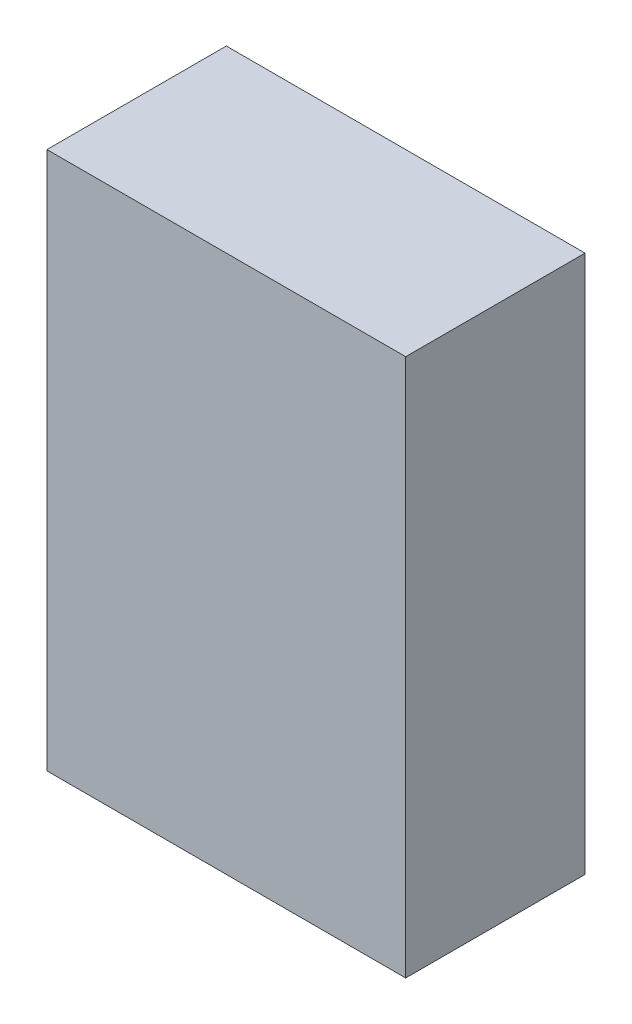
ISO-10303-21;
HEADER;
FILE_DESCRIPTION(('STEP AP214'),'2;1');
FILE_NAME('part.step','',(''),(''),'','','');
FILE_SCHEMA(('AUTOMOTIVE_DESIGN { 1 0 10303 214 1 1 1 1 }'));
ENDSEC;
DATA;
#1=APPLICATION_CONTEXT('core data for automotive mechanical design processes');
#2=APPLICATION_PROTOCOL_DEFINITION('international standard','automotive_design',2000,#1);
#3=PRODUCT_CONTEXT('',#1,'mechanical');
#4=PRODUCT('Part','Part','',(#3));
#5=PRODUCT_RELATED_PRODUCT_CATEGORY('part','',(#4));
#6=PRODUCT_DEFINITION_FORMATION('','',#4);
#7=PRODUCT_DEFINITION_CONTEXT('part definition',#1,'design');
#8=PRODUCT_DEFINITION('design','',#6,#7);
#9=PRODUCT_DEFINITION_SHAPE('','',#8);
#10=(LENGTH_UNIT() NAMED_UNIT(*) SI_UNIT(.MILLI.,.METRE.));
#11=(NAMED_UNIT(*) PLANE_ANGLE_UNIT() SI_UNIT($,.RADIAN.));
#12=(NAMED_UNIT(*) SI_UNIT($,.STERADIAN.) SOLID_ANGLE_UNIT());
#13=UNCERTAINTY_MEASURE_WITH_UNIT(LENGTH_MEASURE(1.E-05),#10,'distance_accuracy_value','');
#14=(GEOMETRIC_REPRESENTATION_CONTEXT(3) GLOBAL_UNCERTAINTY_ASSIGNED_CONTEXT((#13)) GLOBAL_UNIT_ASSIGNED_CONTEXT((#10,
#11,#12)) REPRESENTATION_CONTEXT('',''));
#15=CARTESIAN_POINT('',(0.,0.,0.));
#16=DIRECTION('',(0.,0.,1.));
#17=DIRECTION('',(1.,0.,0.));
#18=AXIS2_PLACEMENT_3D('',#15,#16,#17);
#19=CARTESIAN_POINT('',(-1.38414634146342,28.5243902439024,10.));
#20=DIRECTION('',(1.,0.,0.));
#21=DIRECTION('',(0.,1.,0.));
#22=AXIS2_PLACEMENT_3D('',#19,#20,#21);
#23=PLANE('',#22);
#24=DIRECTION('',(0.,-1.,0.));
#25=VECTOR('',#24,1.);
#26=CARTESIAN_POINT('',(-1.38414634146342,28.5243902439024,0.));
#27=LINE('',#26,#25);
#28=CARTESIAN_POINT('',(-1.38414634146342,28.5243902439024,0.));
#29=VERTEX_POINT('',#28);
#30=CARTESIAN_POINT('',(-1.38414634146341,-1.47560975609756,0.));
#31=VERTEX_POINT('',#30);
#32=EDGE_CURVE('E95',#29,#31,#27,.T.);
#33=ORIENTED_EDGE('',*,*,#32,.T.);
#34=DIRECTION('',(0.,0.,-1.));
#35=VECTOR('',#34,1.);
#36=CARTESIAN_POINT('',(-1.38414634146341,-1.47560975609756,10.));
#37=LINE('',#36,#35);
#38=CARTESIAN_POINT('',(-1.38414634146341,-1.47560975609756,10.));
#39=VERTEX_POINT('',#38);
#40=EDGE_CURVE('E11',#39,#31,#37,.T.);
#41=ORIENTED_EDGE('',*,*,#40,.F.);
#42=DIRECTION('',(0.,-1.,0.));
#43=VECTOR('',#42,1.);
#44=CARTESIAN_POINT('',(-1.38414634146342,28.5243902439024,10.));
#45=LINE('',#44,#43);
#46=CARTESIAN_POINT('',(-1.38414634146342,28.5243902439024,10.));
#47=VERTEX_POINT('',#46);
#48=EDGE_CURVE('E83',#47,#39,#45,.T.);
#49=ORIENTED_EDGE('',*,*,#48,.F.);
#50=DIRECTION('',(0.,0.,-1.));
#51=VECTOR('',#50,1.);
#52=CARTESIAN_POINT('',(-1.38414634146342,28.5243902439024,10.));
#53=LINE('',#52,#51);
#54=EDGE_CURVE('E91',#47,#29,#53,.T.);
#55=ORIENTED_EDGE('',*,*,#54,.T.);
#56=EDGE_LOOP('',(#33,#41,#49,#55));
#57=FACE_BOUND('',#56,.T.);
#58=ADVANCED_FACE('F32',(#57),#23,.F.);
#59=CARTESIAN_POINT('',(-1.38414634146341,-1.47560975609756,10.));
#60=DIRECTION('',(0.,1.,0.));
#61=DIRECTION('',(0.,0.,1.));
#62=AXIS2_PLACEMENT_3D('',#59,#60,#61);
#63=PLANE('',#62);
#64=DIRECTION('',(1.,0.,0.));
#65=VECTOR('',#64,1.);
#66=CARTESIAN_POINT('',(-1.38414634146341,-1.47560975609756,0.));
#67=LINE('',#66,#65);
#68=CARTESIAN_POINT('',(18.6158536585366,-1.47560975609756,0.));
#69=VERTEX_POINT('',#68);
#70=EDGE_CURVE('E87',#31,#69,#67,.T.);
#71=ORIENTED_EDGE('',*,*,#70,.T.);
#72=DIRECTION('',(0.,0.,-1.));
#73=VECTOR('',#72,1.);
#74=CARTESIAN_POINT('',(18.6158536585366,-1.47560975609756,10.));
#75=LINE('',#74,#73);
#76=CARTESIAN_POINT('',(18.6158536585366,-1.47560975609756,10.));
#77=VERTEX_POINT('',#76);
#78=EDGE_CURVE('E40',#77,#69,#75,.T.);
#79=ORIENTED_EDGE('',*,*,#78,.F.);
#80=DIRECTION('',(1.,0.,0.));
#81=VECTOR('',#80,1.);
#82=CARTESIAN_POINT('',(-1.38414634146341,-1.47560975609756,10.));
#83=LINE('',#82,#81);
#84=EDGE_CURVE('E78',#39,#77,#83,.T.);
#85=ORIENTED_EDGE('',*,*,#84,.F.);
#86=ORIENTED_EDGE('',*,*,#40,.T.);
#87=EDGE_LOOP('',(#71,#79,#85,#86));
#88=FACE_BOUND('',#87,.T.);
#89=ADVANCED_FACE('F86',(#88),#63,.F.);
#90=CARTESIAN_POINT('',(18.6158536585366,28.5243902439024,10.));
#91=DIRECTION('',(-1.,0.,0.));
#92=DIRECTION('',(0.,0.,1.));
#93=AXIS2_PLACEMENT_3D('',#90,#91,#92);
#94=PLANE('',#93);
#95=DIRECTION('',(0.,1.,0.));
#96=VECTOR('',#95,1.);
#97=CARTESIAN_POINT('',(18.6158536585366,28.5243902439024,0.));
#98=LINE('',#97,#96);
#99=CARTESIAN_POINT('',(18.6158536585366,28.5243902439024,0.));
#100=VERTEX_POINT('',#99);
#101=EDGE_CURVE('E65',#69,#100,#98,.T.);
#102=ORIENTED_EDGE('',*,*,#101,.T.);
#103=DIRECTION('',(0.,0.,-1.));
#104=VECTOR('',#103,1.);
#105=CARTESIAN_POINT('',(18.6158536585366,28.5243902439024,10.));
#106=LINE('',#105,#104);
#107=CARTESIAN_POINT('',(18.6158536585366,28.5243902439024,10.));
#108=VERTEX_POINT('',#107);
#109=EDGE_CURVE('E88',#108,#100,#106,.T.);
#110=ORIENTED_EDGE('',*,*,#109,.F.);
#111=DIRECTION('',(0.,1.,0.));
#112=VECTOR('',#111,1.);
#113=CARTESIAN_POINT('',(18.6158536585366,28.5243902439024,10.));
#114=LINE('',#113,#112);
#115=EDGE_CURVE('E81',#77,#108,#114,.T.);
#116=ORIENTED_EDGE('',*,*,#115,.F.);
#117=ORIENTED_EDGE('',*,*,#78,.T.);
#118=EDGE_LOOP('',(#102,#110,#116,#117));
#119=FACE_BOUND('',#118,.T.);
#120=ADVANCED_FACE('F89',(#119),#94,.F.);
#121=CARTESIAN_POINT('',(-1.38414634146342,28.5243902439024,10.));
#122=DIRECTION('',(0.,-1.,0.));
#123=DIRECTION('',(0.,0.,-1.));
#124=AXIS2_PLACEMENT_3D('',#121,#122,#123);
#125=PLANE('',#124);
#126=DIRECTION('',(-1.,0.,0.));
#127=VECTOR('',#126,1.);
#128=CARTESIAN_POINT('',(-1.38414634146342,28.5243902439024,0.));
#129=LINE('',#128,#127);
#130=EDGE_CURVE('E71',#100,#29,#129,.T.);
#131=ORIENTED_EDGE('',*,*,#130,.T.);
#132=ORIENTED_EDGE('',*,*,#54,.F.);
#133=DIRECTION('',(-1.,0.,0.));
#134=VECTOR('',#133,1.);
#135=CARTESIAN_POINT('',(-1.38414634146342,28.5243902439024,10.));
#136=LINE('',#135,#134);
#137=EDGE_CURVE('E48',#108,#47,#136,.T.);
#138=ORIENTED_EDGE('',*,*,#137,.F.);
#139=ORIENTED_EDGE('',*,*,#109,.T.);
#140=EDGE_LOOP('',(#131,#132,#138,#139));
#141=FACE_BOUND('',#140,.T.);
#142=ADVANCED_FACE('F102',(#141),#125,.F.);
#143=CARTESIAN_POINT('',(0.,0.,10.));
#144=DIRECTION('',(0.,0.,1.));
#145=DIRECTION('',(1.,0.,0.));
#146=AXIS2_PLACEMENT_3D('',#143,#144,#145);
#147=PLANE('',#146);
#148=ORIENTED_EDGE('',*,*,#48,.T.);
#149=ORIENTED_EDGE('',*,*,#84,.T.);
#150=ORIENTED_EDGE('',*,*,#115,.T.);
#151=ORIENTED_EDGE('',*,*,#137,.T.);
#152=EDGE_LOOP('',(#148,#149,#150,#151));
#153=FACE_BOUND('',#152,.T.);
#154=ADVANCED_FACE('F79',(#153),#147,.T.);
#155=CARTESIAN_POINT('',(0.,0.,0.));
#156=DIRECTION('',(0.,0.,1.));
#157=DIRECTION('',(1.,0.,0.));
#158=AXIS2_PLACEMENT_3D('',#155,#156,#157);
#159=PLANE('',#158);
#160=ORIENTED_EDGE('',*,*,#32,.F.);
#161=ORIENTED_EDGE('',*,*,#130,.F.);
#162=ORIENTED_EDGE('',*,*,#101,.F.);
#163=ORIENTED_EDGE('',*,*,#70,.F.);
#164=EDGE_LOOP('',(#160,#161,#162,#163));
#165=FACE_BOUND('',#164,.T.);
#166=ADVANCED_FACE('F105',(#165),#159,.F.);
#167=CLOSED_SHELL('',(#58,#89,#120,#142,#154,#166));
#168=MANIFOLD_SOLID_BREP('B2',#167);
#169=ADVANCED_BREP_SHAPE_REPRESENTATION('',(#18,#168),#14);
#170=SHAPE_DEFINITION_REPRESENTATION(#9,#169);
ENDSEC;
END-ISO-10303-21;
